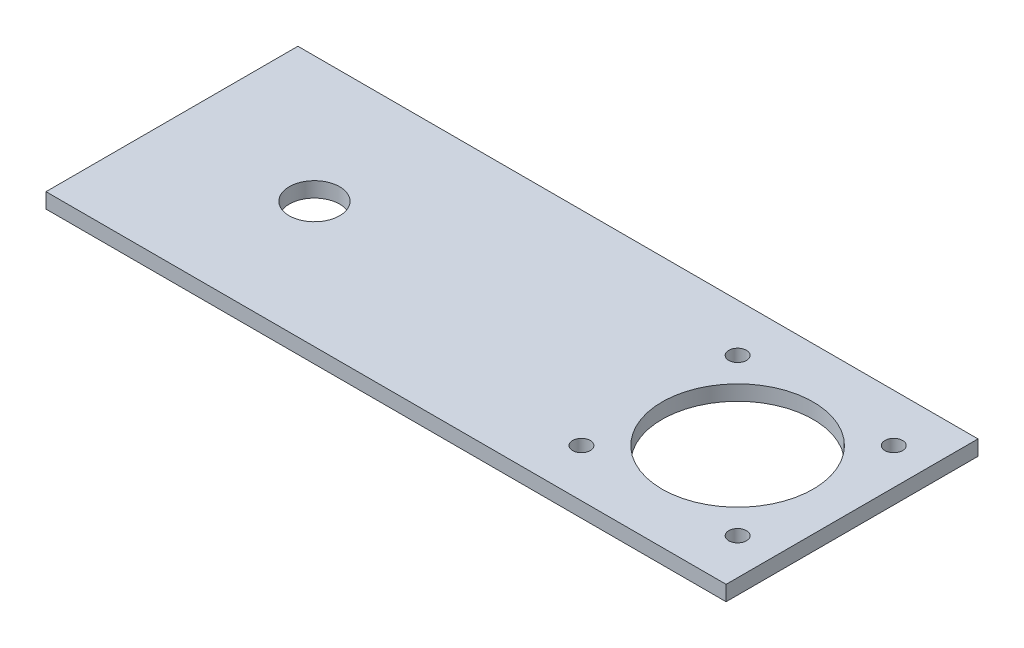
ISO-10303-21;
HEADER;
FILE_DESCRIPTION(('STEP AP214'),'2;1');
FILE_NAME('part.step','',(''),(''),'','','');
FILE_SCHEMA(('AUTOMOTIVE_DESIGN { 1 0 10303 214 1 1 1 1 }'));
ENDSEC;
DATA;
#1=APPLICATION_CONTEXT('core data for automotive mechanical design processes');
#2=APPLICATION_PROTOCOL_DEFINITION('international standard','automotive_design',2000,#1);
#3=PRODUCT_CONTEXT('',#1,'mechanical');
#4=PRODUCT('Part','Part','',(#3));
#5=PRODUCT_RELATED_PRODUCT_CATEGORY('part','',(#4));
#6=PRODUCT_DEFINITION_FORMATION('','',#4);
#7=PRODUCT_DEFINITION_CONTEXT('part definition',#1,'design');
#8=PRODUCT_DEFINITION('design','',#6,#7);
#9=PRODUCT_DEFINITION_SHAPE('','',#8);
#10=(LENGTH_UNIT() NAMED_UNIT(*) SI_UNIT(.MILLI.,.METRE.));
#11=(NAMED_UNIT(*) PLANE_ANGLE_UNIT() SI_UNIT($,.RADIAN.));
#12=(NAMED_UNIT(*) SI_UNIT($,.STERADIAN.) SOLID_ANGLE_UNIT());
#13=UNCERTAINTY_MEASURE_WITH_UNIT(LENGTH_MEASURE(1.E-05),#10,'distance_accuracy_value','');
#14=(GEOMETRIC_REPRESENTATION_CONTEXT(3) GLOBAL_UNCERTAINTY_ASSIGNED_CONTEXT((#13)) GLOBAL_UNIT_ASSIGNED_CONTEXT((#10,
#11,#12)) REPRESENTATION_CONTEXT('',''));
#15=CARTESIAN_POINT('',(0.,0.,0.));
#16=DIRECTION('',(0.,0.,1.));
#17=DIRECTION('',(1.,0.,0.));
#18=AXIS2_PLACEMENT_3D('',#15,#16,#17);
#19=CARTESIAN_POINT('',(0.,3.,0.));
#20=DIRECTION('',(0.,-1.,0.));
#21=DIRECTION('',(0.,0.,-1.));
#22=AXIS2_PLACEMENT_3D('',#19,#20,#21);
#23=PLANE('',#22);
#24=DIRECTION('',(0.,0.,1.));
#25=VECTOR('',#24,1.);
#26=CARTESIAN_POINT('',(0.,3.,0.));
#27=LINE('',#26,#25);
#28=CARTESIAN_POINT('',(0.,3.,-50.));
#29=VERTEX_POINT('',#28);
#30=CARTESIAN_POINT('',(0.,3.,0.));
#31=VERTEX_POINT('',#30);
#32=EDGE_CURVE('E85',#29,#31,#27,.T.);
#33=ORIENTED_EDGE('',*,*,#32,.T.);
#34=DIRECTION('',(1.,0.,0.));
#35=VECTOR('',#34,1.);
#36=CARTESIAN_POINT('',(0.,3.,0.));
#37=LINE('',#36,#35);
#38=CARTESIAN_POINT('',(135.,3.,0.));
#39=VERTEX_POINT('',#38);
#40=EDGE_CURVE('E80',#31,#39,#37,.T.);
#41=ORIENTED_EDGE('',*,*,#40,.T.);
#42=DIRECTION('',(0.,0.,-1.));
#43=VECTOR('',#42,1.);
#44=CARTESIAN_POINT('',(135.,3.,0.));
#45=LINE('',#44,#43);
#46=CARTESIAN_POINT('',(135.,3.,-50.));
#47=VERTEX_POINT('',#46);
#48=EDGE_CURVE('E83',#39,#47,#45,.T.);
#49=ORIENTED_EDGE('',*,*,#48,.T.);
#50=DIRECTION('',(-1.,0.,0.));
#51=VECTOR('',#50,1.);
#52=CARTESIAN_POINT('',(0.,3.,-50.));
#53=LINE('',#52,#51);
#54=EDGE_CURVE('E50',#47,#29,#53,.T.);
#55=ORIENTED_EDGE('',*,*,#54,.T.);
#56=EDGE_LOOP('',(#33,#41,#49,#55));
#57=FACE_BOUND('',#56,.T.);
#58=CARTESIAN_POINT('',(28.2842712474619,3.,-25.));
#59=DIRECTION('',(0.,1.,0.));
#60=DIRECTION('',(0.,0.,1.));
#61=AXIS2_PLACEMENT_3D('',#58,#59,#60);
#62=CIRCLE('',#61,5.);
#63=CARTESIAN_POINT('',(28.2842712474619,3.,-20.));
#64=VERTEX_POINT('',#63);
#65=EDGE_CURVE('E100',#64,#64,#62,.T.);
#66=ORIENTED_EDGE('',*,*,#65,.F.);
#67=EDGE_LOOP('',(#66));
#68=FACE_BOUND('',#67,.T.);
#69=CARTESIAN_POINT('',(112.284271247462,3.,-25.));
#70=DIRECTION('',(0.,1.,0.));
#71=DIRECTION('',(0.,0.,1.));
#72=AXIS2_PLACEMENT_3D('',#69,#70,#71);
#73=CIRCLE('',#72,15.);
#74=CARTESIAN_POINT('',(112.284271247462,3.,-10.));
#75=VERTEX_POINT('',#74);
#76=EDGE_CURVE('E115',#75,#75,#73,.T.);
#77=ORIENTED_EDGE('',*,*,#76,.F.);
#78=EDGE_LOOP('',(#77));
#79=FACE_BOUND('',#78,.T.);
#80=CARTESIAN_POINT('',(96.7842712474619,3.,-40.5));
#81=DIRECTION('',(0.,1.,0.));
#82=DIRECTION('',(0.,0.,1.));
#83=AXIS2_PLACEMENT_3D('',#80,#81,#82);
#84=CIRCLE('',#83,1.75);
#85=CARTESIAN_POINT('',(96.7842712474619,3.,-38.75));
#86=VERTEX_POINT('',#85);
#87=EDGE_CURVE('E121',#86,#86,#84,.T.);
#88=ORIENTED_EDGE('',*,*,#87,.F.);
#89=EDGE_LOOP('',(#88));
#90=FACE_BOUND('',#89,.T.);
#91=CARTESIAN_POINT('',(96.7842712474619,3.,-9.49999999999999));
#92=DIRECTION('',(0.,1.,0.));
#93=DIRECTION('',(0.,0.,1.));
#94=AXIS2_PLACEMENT_3D('',#91,#92,#93);
#95=CIRCLE('',#94,1.75);
#96=CARTESIAN_POINT('',(96.7842712474619,3.,-7.74999999999999));
#97=VERTEX_POINT('',#96);
#98=EDGE_CURVE('E127',#97,#97,#95,.T.);
#99=ORIENTED_EDGE('',*,*,#98,.F.);
#100=EDGE_LOOP('',(#99));
#101=FACE_BOUND('',#100,.T.);
#102=CARTESIAN_POINT('',(127.784271247462,3.,-9.49999999999999));
#103=DIRECTION('',(0.,1.,0.));
#104=DIRECTION('',(0.,0.,1.));
#105=AXIS2_PLACEMENT_3D('',#102,#103,#104);
#106=CIRCLE('',#105,1.75000000000001);
#107=CARTESIAN_POINT('',(127.784271247462,3.,-7.74999999999998));
#108=VERTEX_POINT('',#107);
#109=EDGE_CURVE('E133',#108,#108,#106,.T.);
#110=ORIENTED_EDGE('',*,*,#109,.F.);
#111=EDGE_LOOP('',(#110));
#112=FACE_BOUND('',#111,.T.);
#113=CARTESIAN_POINT('',(127.784271247462,3.,-40.5));
#114=DIRECTION('',(0.,1.,0.));
#115=DIRECTION('',(0.,0.,1.));
#116=AXIS2_PLACEMENT_3D('',#113,#114,#115);
#117=CIRCLE('',#116,1.75000000000001);
#118=CARTESIAN_POINT('',(127.784271247462,3.,-38.75));
#119=VERTEX_POINT('',#118);
#120=EDGE_CURVE('E139',#119,#119,#117,.T.);
#121=ORIENTED_EDGE('',*,*,#120,.F.);
#122=EDGE_LOOP('',(#121));
#123=FACE_BOUND('',#122,.T.);
#124=ADVANCED_FACE('F33',(#57,#68,#79,#90,#101,#112,#123),#23,.F.);
#125=CARTESIAN_POINT('',(0.,0.,0.));
#126=DIRECTION('',(0.,-1.,0.));
#127=DIRECTION('',(0.,0.,-1.));
#128=AXIS2_PLACEMENT_3D('',#125,#126,#127);
#129=PLANE('',#128);
#130=CARTESIAN_POINT('',(127.784271247462,0.,-9.49999999999999));
#131=DIRECTION('',(0.,1.,0.));
#132=DIRECTION('',(0.,0.,1.));
#133=AXIS2_PLACEMENT_3D('',#130,#131,#132);
#134=CIRCLE('',#133,1.75000000000001);
#135=CARTESIAN_POINT('',(127.784271247462,0.,-7.74999999999998));
#136=VERTEX_POINT('',#135);
#137=EDGE_CURVE('E136',#136,#136,#134,.T.);
#138=ORIENTED_EDGE('',*,*,#137,.T.);
#139=EDGE_LOOP('',(#138));
#140=FACE_BOUND('',#139,.T.);
#141=CARTESIAN_POINT('',(96.7842712474619,0.,-40.5));
#142=DIRECTION('',(0.,1.,0.));
#143=DIRECTION('',(0.,0.,1.));
#144=AXIS2_PLACEMENT_3D('',#141,#142,#143);
#145=CIRCLE('',#144,1.75);
#146=CARTESIAN_POINT('',(96.7842712474619,0.,-38.75));
#147=VERTEX_POINT('',#146);
#148=EDGE_CURVE('E124',#147,#147,#145,.T.);
#149=ORIENTED_EDGE('',*,*,#148,.T.);
#150=EDGE_LOOP('',(#149));
#151=FACE_BOUND('',#150,.T.);
#152=CARTESIAN_POINT('',(28.2842712474619,0.,-25.));
#153=DIRECTION('',(0.,1.,0.));
#154=DIRECTION('',(0.,0.,1.));
#155=AXIS2_PLACEMENT_3D('',#152,#153,#154);
#156=CIRCLE('',#155,5.);
#157=CARTESIAN_POINT('',(28.2842712474619,0.,-20.));
#158=VERTEX_POINT('',#157);
#159=EDGE_CURVE('E112',#158,#158,#156,.T.);
#160=ORIENTED_EDGE('',*,*,#159,.T.);
#161=EDGE_LOOP('',(#160));
#162=FACE_BOUND('',#161,.T.);
#163=DIRECTION('',(0.,0.,1.));
#164=VECTOR('',#163,1.);
#165=CARTESIAN_POINT('',(0.,0.,0.));
#166=LINE('',#165,#164);
#167=CARTESIAN_POINT('',(0.,0.,-50.));
#168=VERTEX_POINT('',#167);
#169=CARTESIAN_POINT('',(0.,0.,0.));
#170=VERTEX_POINT('',#169);
#171=EDGE_CURVE('E97',#168,#170,#166,.T.);
#172=ORIENTED_EDGE('',*,*,#171,.F.);
#173=DIRECTION('',(-1.,0.,0.));
#174=VECTOR('',#173,1.);
#175=CARTESIAN_POINT('',(0.,0.,-50.));
#176=LINE('',#175,#174);
#177=CARTESIAN_POINT('',(135.,0.,-50.));
#178=VERTEX_POINT('',#177);
#179=EDGE_CURVE('E73',#178,#168,#176,.T.);
#180=ORIENTED_EDGE('',*,*,#179,.F.);
#181=DIRECTION('',(0.,0.,-1.));
#182=VECTOR('',#181,1.);
#183=CARTESIAN_POINT('',(135.,0.,0.));
#184=LINE('',#183,#182);
#185=CARTESIAN_POINT('',(135.,0.,0.));
#186=VERTEX_POINT('',#185);
#187=EDGE_CURVE('E67',#186,#178,#184,.T.);
#188=ORIENTED_EDGE('',*,*,#187,.F.);
#189=DIRECTION('',(1.,0.,0.));
#190=VECTOR('',#189,1.);
#191=CARTESIAN_POINT('',(0.,0.,0.));
#192=LINE('',#191,#190);
#193=EDGE_CURVE('E89',#170,#186,#192,.T.);
#194=ORIENTED_EDGE('',*,*,#193,.F.);
#195=EDGE_LOOP('',(#172,#180,#188,#194));
#196=FACE_BOUND('',#195,.T.);
#197=CARTESIAN_POINT('',(112.284271247462,0.,-25.));
#198=DIRECTION('',(0.,1.,0.));
#199=DIRECTION('',(0.,0.,1.));
#200=AXIS2_PLACEMENT_3D('',#197,#198,#199);
#201=CIRCLE('',#200,15.);
#202=CARTESIAN_POINT('',(112.284271247462,0.,-10.));
#203=VERTEX_POINT('',#202);
#204=EDGE_CURVE('E118',#203,#203,#201,.T.);
#205=ORIENTED_EDGE('',*,*,#204,.T.);
#206=EDGE_LOOP('',(#205));
#207=FACE_BOUND('',#206,.T.);
#208=CARTESIAN_POINT('',(96.7842712474619,0.,-9.49999999999999));
#209=DIRECTION('',(0.,1.,0.));
#210=DIRECTION('',(0.,0.,1.));
#211=AXIS2_PLACEMENT_3D('',#208,#209,#210);
#212=CIRCLE('',#211,1.75);
#213=CARTESIAN_POINT('',(96.7842712474619,0.,-7.74999999999999));
#214=VERTEX_POINT('',#213);
#215=EDGE_CURVE('E130',#214,#214,#212,.T.);
#216=ORIENTED_EDGE('',*,*,#215,.T.);
#217=EDGE_LOOP('',(#216));
#218=FACE_BOUND('',#217,.T.);
#219=CARTESIAN_POINT('',(127.784271247462,0.,-40.5));
#220=DIRECTION('',(0.,1.,0.));
#221=DIRECTION('',(0.,0.,1.));
#222=AXIS2_PLACEMENT_3D('',#219,#220,#221);
#223=CIRCLE('',#222,1.75000000000001);
#224=CARTESIAN_POINT('',(127.784271247462,0.,-38.75));
#225=VERTEX_POINT('',#224);
#226=EDGE_CURVE('E142',#225,#225,#223,.T.);
#227=ORIENTED_EDGE('',*,*,#226,.T.);
#228=EDGE_LOOP('',(#227));
#229=FACE_BOUND('',#228,.T.);
#230=ADVANCED_FACE('F108',(#140,#151,#162,#196,#207,#218,#229),#129,.T.);
#231=CARTESIAN_POINT('',(0.,3.,0.));
#232=DIRECTION('',(1.,0.,0.));
#233=DIRECTION('',(0.,0.,-1.));
#234=AXIS2_PLACEMENT_3D('',#231,#232,#233);
#235=PLANE('',#234);
#236=ORIENTED_EDGE('',*,*,#171,.T.);
#237=DIRECTION('',(0.,-1.,0.));
#238=VECTOR('',#237,1.);
#239=CARTESIAN_POINT('',(0.,3.,0.));
#240=LINE('',#239,#238);
#241=EDGE_CURVE('E11',#31,#170,#240,.T.);
#242=ORIENTED_EDGE('',*,*,#241,.F.);
#243=ORIENTED_EDGE('',*,*,#32,.F.);
#244=DIRECTION('',(0.,-1.,0.));
#245=VECTOR('',#244,1.);
#246=CARTESIAN_POINT('',(0.,3.,-50.));
#247=LINE('',#246,#245);
#248=EDGE_CURVE('E93',#29,#168,#247,.T.);
#249=ORIENTED_EDGE('',*,*,#248,.T.);
#250=EDGE_LOOP('',(#236,#242,#243,#249));
#251=FACE_BOUND('',#250,.T.);
#252=ADVANCED_FACE('F35',(#251),#235,.F.);
#253=CARTESIAN_POINT('',(0.,3.,0.));
#254=DIRECTION('',(0.,0.,-1.));
#255=DIRECTION('',(-1.,0.,0.));
#256=AXIS2_PLACEMENT_3D('',#253,#254,#255);
#257=PLANE('',#256);
#258=ORIENTED_EDGE('',*,*,#193,.T.);
#259=DIRECTION('',(0.,-1.,0.));
#260=VECTOR('',#259,1.);
#261=CARTESIAN_POINT('',(135.,3.,0.));
#262=LINE('',#261,#260);
#263=EDGE_CURVE('E42',#39,#186,#262,.T.);
#264=ORIENTED_EDGE('',*,*,#263,.F.);
#265=ORIENTED_EDGE('',*,*,#40,.F.);
#266=ORIENTED_EDGE('',*,*,#241,.T.);
#267=EDGE_LOOP('',(#258,#264,#265,#266));
#268=FACE_BOUND('',#267,.T.);
#269=ADVANCED_FACE('F88',(#268),#257,.F.);
#270=CARTESIAN_POINT('',(135.,3.,0.));
#271=DIRECTION('',(-1.,0.,0.));
#272=DIRECTION('',(0.,0.,1.));
#273=AXIS2_PLACEMENT_3D('',#270,#271,#272);
#274=PLANE('',#273);
#275=ORIENTED_EDGE('',*,*,#187,.T.);
#276=DIRECTION('',(0.,-1.,0.));
#277=VECTOR('',#276,1.);
#278=CARTESIAN_POINT('',(135.,3.,-50.));
#279=LINE('',#278,#277);
#280=EDGE_CURVE('E90',#47,#178,#279,.T.);
#281=ORIENTED_EDGE('',*,*,#280,.F.);
#282=ORIENTED_EDGE('',*,*,#48,.F.);
#283=ORIENTED_EDGE('',*,*,#263,.T.);
#284=EDGE_LOOP('',(#275,#281,#282,#283));
#285=FACE_BOUND('',#284,.T.);
#286=ADVANCED_FACE('F91',(#285),#274,.F.);
#287=CARTESIAN_POINT('',(0.,3.,-50.));
#288=DIRECTION('',(0.,0.,1.));
#289=DIRECTION('',(1.,0.,0.));
#290=AXIS2_PLACEMENT_3D('',#287,#288,#289);
#291=PLANE('',#290);
#292=ORIENTED_EDGE('',*,*,#179,.T.);
#293=ORIENTED_EDGE('',*,*,#248,.F.);
#294=ORIENTED_EDGE('',*,*,#54,.F.);
#295=ORIENTED_EDGE('',*,*,#280,.T.);
#296=EDGE_LOOP('',(#292,#293,#294,#295));
#297=FACE_BOUND('',#296,.T.);
#298=ADVANCED_FACE('F105',(#297),#291,.F.);
#299=CARTESIAN_POINT('',(28.2842712474619,3.,-25.));
#300=DIRECTION('',(0.,-1.,0.));
#301=DIRECTION('',(0.,0.,-1.));
#302=AXIS2_PLACEMENT_3D('',#299,#300,#301);
#303=CYLINDRICAL_SURFACE('',#302,5.);
#304=ORIENTED_EDGE('',*,*,#65,.T.);
#305=EDGE_LOOP('',(#304));
#306=FACE_BOUND('',#305,.T.);
#307=ORIENTED_EDGE('',*,*,#159,.F.);
#308=EDGE_LOOP('',(#307));
#309=FACE_BOUND('',#308,.T.);
#310=ADVANCED_FACE('F159',(#306,#309),#303,.F.);
#311=CARTESIAN_POINT('',(112.284271247462,3.,-25.));
#312=DIRECTION('',(0.,-1.,0.));
#313=DIRECTION('',(0.,0.,-1.));
#314=AXIS2_PLACEMENT_3D('',#311,#312,#313);
#315=CYLINDRICAL_SURFACE('',#314,15.);
#316=ORIENTED_EDGE('',*,*,#76,.T.);
#317=EDGE_LOOP('',(#316));
#318=FACE_BOUND('',#317,.T.);
#319=ORIENTED_EDGE('',*,*,#204,.F.);
#320=EDGE_LOOP('',(#319));
#321=FACE_BOUND('',#320,.T.);
#322=ADVANCED_FACE('F205',(#318,#321),#315,.F.);
#323=CARTESIAN_POINT('',(96.7842712474619,3.,-40.5));
#324=DIRECTION('',(0.,-1.,0.));
#325=DIRECTION('',(0.,0.,-1.));
#326=AXIS2_PLACEMENT_3D('',#323,#324,#325);
#327=CYLINDRICAL_SURFACE('',#326,1.75);
#328=ORIENTED_EDGE('',*,*,#87,.T.);
#329=EDGE_LOOP('',(#328));
#330=FACE_BOUND('',#329,.T.);
#331=ORIENTED_EDGE('',*,*,#148,.F.);
#332=EDGE_LOOP('',(#331));
#333=FACE_BOUND('',#332,.T.);
#334=ADVANCED_FACE('F213',(#330,#333),#327,.F.);
#335=CARTESIAN_POINT('',(96.7842712474619,3.,-9.49999999999999));
#336=DIRECTION('',(0.,-1.,0.));
#337=DIRECTION('',(0.,0.,-1.));
#338=AXIS2_PLACEMENT_3D('',#335,#336,#337);
#339=CYLINDRICAL_SURFACE('',#338,1.75);
#340=ORIENTED_EDGE('',*,*,#98,.T.);
#341=EDGE_LOOP('',(#340));
#342=FACE_BOUND('',#341,.T.);
#343=ORIENTED_EDGE('',*,*,#215,.F.);
#344=EDGE_LOOP('',(#343));
#345=FACE_BOUND('',#344,.T.);
#346=ADVANCED_FACE('F221',(#342,#345),#339,.F.);
#347=CARTESIAN_POINT('',(127.784271247462,3.,-9.49999999999999));
#348=DIRECTION('',(0.,-1.,0.));
#349=DIRECTION('',(0.,0.,-1.));
#350=AXIS2_PLACEMENT_3D('',#347,#348,#349);
#351=CYLINDRICAL_SURFACE('',#350,1.75000000000001);
#352=ORIENTED_EDGE('',*,*,#109,.T.);
#353=EDGE_LOOP('',(#352));
#354=FACE_BOUND('',#353,.T.);
#355=ORIENTED_EDGE('',*,*,#137,.F.);
#356=EDGE_LOOP('',(#355));
#357=FACE_BOUND('',#356,.T.);
#358=ADVANCED_FACE('F230',(#354,#357),#351,.F.);
#359=CARTESIAN_POINT('',(127.784271247462,3.,-40.5));
#360=DIRECTION('',(0.,-1.,0.));
#361=DIRECTION('',(0.,0.,-1.));
#362=AXIS2_PLACEMENT_3D('',#359,#360,#361);
#363=CYLINDRICAL_SURFACE('',#362,1.75000000000001);
#364=ORIENTED_EDGE('',*,*,#120,.T.);
#365=EDGE_LOOP('',(#364));
#366=FACE_BOUND('',#365,.T.);
#367=ORIENTED_EDGE('',*,*,#226,.F.);
#368=EDGE_LOOP('',(#367));
#369=FACE_BOUND('',#368,.T.);
#370=ADVANCED_FACE('F148',(#366,#369),#363,.F.);
#371=CLOSED_SHELL('',(#124,#230,#252,#269,#286,#298,#310,#322,#334,#346,#358,#370));
#372=MANIFOLD_SOLID_BREP('B2',#371);
#373=ADVANCED_BREP_SHAPE_REPRESENTATION('',(#18,#372),#14);
#374=SHAPE_DEFINITION_REPRESENTATION(#9,#373);
ENDSEC;
END-ISO-10303-21;
